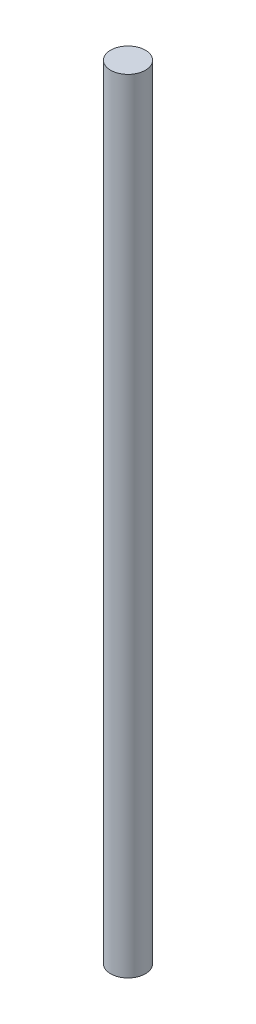
ISO-10303-21;
HEADER;
FILE_DESCRIPTION(('STEP AP214'),'2;1');
FILE_NAME('part.step','',(''),(''),'','','');
FILE_SCHEMA(('AUTOMOTIVE_DESIGN { 1 0 10303 214 1 1 1 1 }'));
ENDSEC;
DATA;
#1=APPLICATION_CONTEXT('core data for automotive mechanical design processes');
#2=APPLICATION_PROTOCOL_DEFINITION('international standard','automotive_design',2000,#1);
#3=PRODUCT_CONTEXT('',#1,'mechanical');
#4=PRODUCT('Part','Part','',(#3));
#5=PRODUCT_RELATED_PRODUCT_CATEGORY('part','',(#4));
#6=PRODUCT_DEFINITION_FORMATION('','',#4);
#7=PRODUCT_DEFINITION_CONTEXT('part definition',#1,'design');
#8=PRODUCT_DEFINITION('design','',#6,#7);
#9=PRODUCT_DEFINITION_SHAPE('','',#8);
#10=(LENGTH_UNIT() NAMED_UNIT(*) SI_UNIT(.MILLI.,.METRE.));
#11=(NAMED_UNIT(*) PLANE_ANGLE_UNIT() SI_UNIT($,.RADIAN.));
#12=(NAMED_UNIT(*) SI_UNIT($,.STERADIAN.) SOLID_ANGLE_UNIT());
#13=UNCERTAINTY_MEASURE_WITH_UNIT(LENGTH_MEASURE(1.E-05),#10,'distance_accuracy_value','');
#14=(GEOMETRIC_REPRESENTATION_CONTEXT(3) GLOBAL_UNCERTAINTY_ASSIGNED_CONTEXT((#13)) GLOBAL_UNIT_ASSIGNED_CONTEXT((#10,
#11,#12)) REPRESENTATION_CONTEXT('',''));
#15=CARTESIAN_POINT('',(0.,0.,0.));
#16=DIRECTION('',(0.,0.,1.));
#17=DIRECTION('',(1.,0.,0.));
#18=AXIS2_PLACEMENT_3D('',#15,#16,#17);
#19=CARTESIAN_POINT('',(0.,45.,0.));
#20=DIRECTION('',(0.,-1.,0.));
#21=DIRECTION('',(0.,0.,-1.));
#22=AXIS2_PLACEMENT_3D('',#19,#20,#21);
#23=CYLINDRICAL_SURFACE('',#22,1.);
#24=CARTESIAN_POINT('',(0.,45.,0.));
#25=DIRECTION('',(0.,1.,0.));
#26=DIRECTION('',(0.,0.,1.));
#27=AXIS2_PLACEMENT_3D('',#24,#25,#26);
#28=CIRCLE('',#27,1.);
#29=CARTESIAN_POINT('',(0.,45.,-1.));
#30=VERTEX_POINT('',#29);
#31=EDGE_CURVE('E10',#30,#30,#28,.T.);
#32=CARTESIAN_POINT('',(0.,0.,0.));
#33=DIRECTION('',(0.,1.,0.));
#34=DIRECTION('',(0.,0.,1.));
#35=AXIS2_PLACEMENT_3D('',#32,#33,#34);
#36=CIRCLE('',#35,1.);
#37=CARTESIAN_POINT('',(0.,0.,-1.));
#38=VERTEX_POINT('',#37);
#39=EDGE_CURVE('E34',#38,#38,#36,.T.);
#40=CARTESIAN_POINT('',(0.,45.,-1.));
#41=CARTESIAN_POINT('',(0.,44.53125,-1.));
#42=CARTESIAN_POINT('',(0.,44.0625,-1.));
#43=CARTESIAN_POINT('',(0.,43.125,-1.));
#44=CARTESIAN_POINT('',(0.,42.65625,-1.));
#45=CARTESIAN_POINT('',(0.,41.71875,-1.));
#46=CARTESIAN_POINT('',(0.,41.25,-1.));
#47=CARTESIAN_POINT('',(0.,40.3125,-1.));
#48=CARTESIAN_POINT('',(0.,39.84375,-1.));
#49=CARTESIAN_POINT('',(0.,38.90625,-1.));
#50=CARTESIAN_POINT('',(0.,38.4375,-1.));
#51=CARTESIAN_POINT('',(0.,37.5,-1.));
#52=CARTESIAN_POINT('',(0.,37.03125,-1.));
#53=CARTESIAN_POINT('',(0.,36.09375,-1.));
#54=CARTESIAN_POINT('',(0.,35.625,-1.));
#55=CARTESIAN_POINT('',(0.,34.6875,-1.));
#56=CARTESIAN_POINT('',(0.,34.21875,-1.));
#57=CARTESIAN_POINT('',(0.,33.28125,-1.));
#58=CARTESIAN_POINT('',(0.,32.8125,-1.));
#59=CARTESIAN_POINT('',(0.,31.875,-1.));
#60=CARTESIAN_POINT('',(0.,31.40625,-1.));
#61=CARTESIAN_POINT('',(0.,30.46875,-1.));
#62=CARTESIAN_POINT('',(0.,30.,-1.));
#63=CARTESIAN_POINT('',(0.,29.0625,-1.));
#64=CARTESIAN_POINT('',(0.,28.59375,-1.));
#65=CARTESIAN_POINT('',(0.,27.65625,-1.));
#66=CARTESIAN_POINT('',(0.,27.1875,-1.));
#67=CARTESIAN_POINT('',(0.,26.25,-1.));
#68=CARTESIAN_POINT('',(0.,25.78125,-1.));
#69=CARTESIAN_POINT('',(0.,24.84375,-1.));
#70=CARTESIAN_POINT('',(0.,24.375,-1.));
#71=CARTESIAN_POINT('',(0.,23.4375,-1.));
#72=CARTESIAN_POINT('',(0.,22.96875,-1.));
#73=CARTESIAN_POINT('',(0.,22.03125,-1.));
#74=CARTESIAN_POINT('',(0.,21.5625,-1.));
#75=CARTESIAN_POINT('',(0.,20.625,-1.));
#76=CARTESIAN_POINT('',(0.,20.15625,-1.));
#77=CARTESIAN_POINT('',(0.,19.21875,-1.));
#78=CARTESIAN_POINT('',(0.,18.75,-1.));
#79=CARTESIAN_POINT('',(0.,17.8125,-1.));
#80=CARTESIAN_POINT('',(0.,17.34375,-1.));
#81=CARTESIAN_POINT('',(0.,16.40625,-1.));
#82=CARTESIAN_POINT('',(0.,15.9375,-1.));
#83=CARTESIAN_POINT('',(0.,15.,-1.));
#84=CARTESIAN_POINT('',(0.,14.53125,-1.));
#85=CARTESIAN_POINT('',(0.,13.59375,-1.));
#86=CARTESIAN_POINT('',(0.,13.125,-1.));
#87=CARTESIAN_POINT('',(0.,12.1875,-1.));
#88=CARTESIAN_POINT('',(0.,11.71875,-1.));
#89=CARTESIAN_POINT('',(0.,10.78125,-1.));
#90=CARTESIAN_POINT('',(0.,10.3125,-1.));
#91=CARTESIAN_POINT('',(0.,9.37499999999999,-1.));
#92=CARTESIAN_POINT('',(0.,8.90624999999999,-1.));
#93=CARTESIAN_POINT('',(0.,7.96874999999999,-1.));
#94=CARTESIAN_POINT('',(0.,7.5,-1.));
#95=CARTESIAN_POINT('',(0.,6.56249999999999,-1.));
#96=CARTESIAN_POINT('',(0.,6.09374999999999,-1.));
#97=CARTESIAN_POINT('',(0.,5.15624999999999,-1.));
#98=CARTESIAN_POINT('',(0.,4.68749999999999,-1.));
#99=CARTESIAN_POINT('',(0.,3.74999999999999,-1.));
#100=CARTESIAN_POINT('',(0.,3.28124999999999,-1.));
#101=CARTESIAN_POINT('',(0.,2.34374999999999,-1.));
#102=CARTESIAN_POINT('',(0.,1.87499999999999,-1.));
#103=CARTESIAN_POINT('',(0.,0.937499999999992,-1.));
#104=CARTESIAN_POINT('',(0.,0.468749999999993,-1.));
#105=CARTESIAN_POINT('',(0.,0.,-1.));
#106=B_SPLINE_CURVE_WITH_KNOTS('',3,(#40,#41,#42,#43,#44,#45,#46,#47,#48,#49,#50,#51,#52,#53,
#54,#55,#56,#57,#58,#59,#60,#61,#62,#63,#64,#65,#66,#67,#68,#69,#70,#71,#72,#73,#74,#75,#76,#77,
#78,#79,#80,#81,#82,#83,#84,#85,#86,#87,#88,#89,#90,#91,#92,#93,#94,#95,#96,#97,#98,#99,#100,
#101,#102,#103,#104,#105),.UNSPECIFIED.,.F.,.F.,(4,2,2,2,2,2,2,2,2,2,2,2,2,2,2,2,2,2,2,2,2,2,2,
2,2,2,2,2,2,2,2,2,4),(0.,1.40625,2.8125,4.21874999999999,5.625,7.03125,8.43749999999999,9.84375,
11.25,12.65625,14.0625,15.46875,16.875,18.28125,19.6875,21.09375,22.5,23.90625,25.3125,26.71875,
28.125,29.53125,30.9375,32.34375,33.75,35.15625,36.5625,37.96875,39.375,40.78125,42.1875,
43.59375,45.),.UNSPECIFIED.);
#107=EDGE_CURVE('BSEAM31',#30,#38,#106,.T.);
#108=ORIENTED_EDGE('',*,*,#31,.F.);
#109=ORIENTED_EDGE('',*,*,#39,.T.);
#110=ORIENTED_EDGE('',*,*,#107,.T.);
#111=ORIENTED_EDGE('',*,*,#107,.F.);
#112=EDGE_LOOP('',(#108,#110,#109,#111));
#113=FACE_BOUND('',#112,.T.);
#114=ADVANCED_FACE('F31',(#113),#23,.T.);
#115=CARTESIAN_POINT('',(0.,45.,0.));
#116=DIRECTION('',(0.,1.,0.));
#117=DIRECTION('',(0.,0.,1.));
#118=AXIS2_PLACEMENT_3D('',#115,#116,#117);
#119=PLANE('',#118);
#120=ORIENTED_EDGE('',*,*,#31,.T.);
#121=EDGE_LOOP('',(#120));
#122=FACE_BOUND('',#121,.T.);
#123=ADVANCED_FACE('F46',(#122),#119,.T.);
#124=CARTESIAN_POINT('',(0.,0.,0.));
#125=DIRECTION('',(0.,1.,0.));
#126=DIRECTION('',(0.,0.,1.));
#127=AXIS2_PLACEMENT_3D('',#124,#125,#126);
#128=PLANE('',#127);
#129=ORIENTED_EDGE('',*,*,#39,.F.);
#130=EDGE_LOOP('',(#129));
#131=FACE_BOUND('',#130,.T.);
#132=ADVANCED_FACE('F44',(#131),#128,.F.);
#133=CLOSED_SHELL('',(#114,#123,#132));
#134=MANIFOLD_SOLID_BREP('B2',#133);
#135=ADVANCED_BREP_SHAPE_REPRESENTATION('',(#18,#134),#14);
#136=SHAPE_DEFINITION_REPRESENTATION(#9,#135);
ENDSEC;
END-ISO-10303-21;
